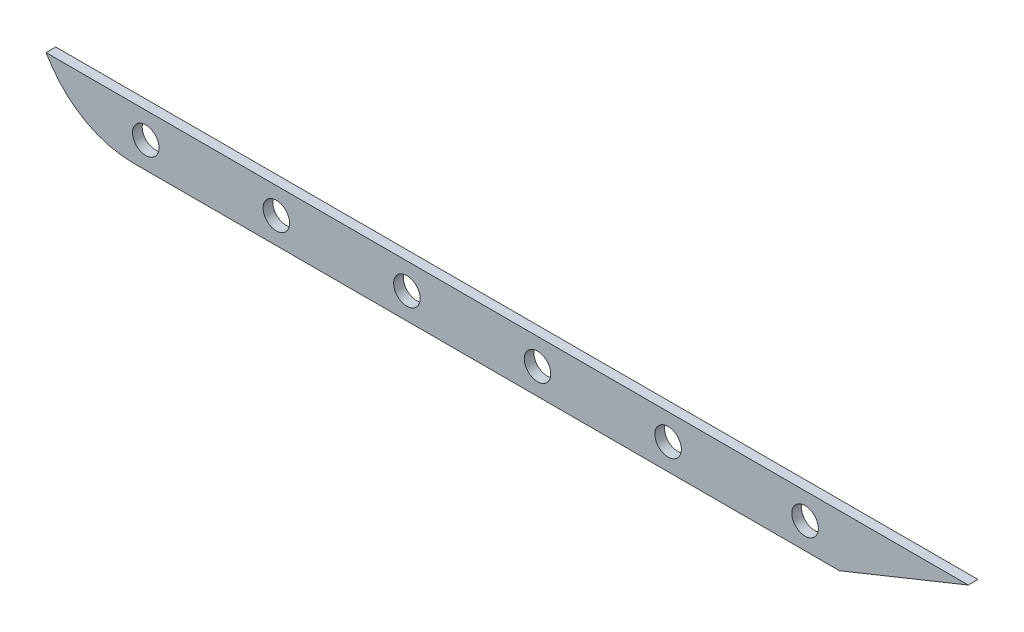
ISO-10303-21;
HEADER;
FILE_DESCRIPTION(('STEP AP214'),'2;1');
FILE_NAME('part.step','',(''),(''),'','','');
FILE_SCHEMA(('AUTOMOTIVE_DESIGN { 1 0 10303 214 1 1 1 1 }'));
ENDSEC;
DATA;
#1=APPLICATION_CONTEXT('core data for automotive mechanical design processes');
#2=APPLICATION_PROTOCOL_DEFINITION('international standard','automotive_design',2000,#1);
#3=PRODUCT_CONTEXT('',#1,'mechanical');
#4=PRODUCT('Part','Part','',(#3));
#5=PRODUCT_RELATED_PRODUCT_CATEGORY('part','',(#4));
#6=PRODUCT_DEFINITION_FORMATION('','',#4);
#7=PRODUCT_DEFINITION_CONTEXT('part definition',#1,'design');
#8=PRODUCT_DEFINITION('design','',#6,#7);
#9=PRODUCT_DEFINITION_SHAPE('','',#8);
#10=(LENGTH_UNIT() NAMED_UNIT(*) SI_UNIT(.MILLI.,.METRE.));
#11=(NAMED_UNIT(*) PLANE_ANGLE_UNIT() SI_UNIT($,.RADIAN.));
#12=(NAMED_UNIT(*) SI_UNIT($,.STERADIAN.) SOLID_ANGLE_UNIT());
#13=UNCERTAINTY_MEASURE_WITH_UNIT(LENGTH_MEASURE(1.E-05),#10,'distance_accuracy_value','');
#14=(GEOMETRIC_REPRESENTATION_CONTEXT(3) GLOBAL_UNCERTAINTY_ASSIGNED_CONTEXT((#13)) GLOBAL_UNIT_ASSIGNED_CONTEXT((#10,
#11,#12)) REPRESENTATION_CONTEXT('',''));
#15=CARTESIAN_POINT('',(0.,0.,0.));
#16=DIRECTION('',(0.,0.,1.));
#17=DIRECTION('',(1.,0.,0.));
#18=AXIS2_PLACEMENT_3D('',#15,#16,#17);
#19=CARTESIAN_POINT('',(-98.8794117647059,3.85098039215685,4.7625));
#20=DIRECTION('',(0.832050294337844,0.554700196225229,0.));
#21=DIRECTION('',(-0.554700196225229,0.832050294337844,0.));
#22=AXIS2_PLACEMENT_3D('',#19,#20,#21);
#23=PLANE('',#22);
#24=DIRECTION('',(0.554700196225229,-0.832050294337844,0.));
#25=VECTOR('',#24,1.);
#26=CARTESIAN_POINT('',(-98.8794117647059,3.85098039215685,0.));
#27=LINE('',#26,#25);
#28=CARTESIAN_POINT('',(-48.8794117647059,-71.1490196078431,0.));
#29=VERTEX_POINT('',#28);
#30=CARTESIAN_POINT('',(-46.1290054854985,-75.2746290266542,0.));
#31=VERTEX_POINT('',#30);
#32=EDGE_CURVE('E186',#29,#31,#27,.T.);
#33=ORIENTED_EDGE('',*,*,#32,.T.);
#34=DIRECTION('',(0.,0.,-1.));
#35=VECTOR('',#34,1.);
#36=CARTESIAN_POINT('',(-46.1290054854985,-75.2746290266542,4.7625));
#37=LINE('',#36,#35);
#38=CARTESIAN_POINT('',(-46.1290054854985,-75.2746290266542,4.7625));
#39=VERTEX_POINT('',#38);
#40=EDGE_CURVE('E58',#31,#39,#37,.F.);
#41=ORIENTED_EDGE('',*,*,#40,.T.);
#42=DIRECTION('',(0.554700196225229,-0.832050294337844,0.));
#43=VECTOR('',#42,1.);
#44=CARTESIAN_POINT('',(-98.8794117647059,3.85098039215685,4.7625));
#45=LINE('',#44,#43);
#46=CARTESIAN_POINT('',(-48.8794117647059,-71.1490196078431,4.7625));
#47=VERTEX_POINT('',#46);
#48=EDGE_CURVE('E108',#47,#39,#45,.T.);
#49=ORIENTED_EDGE('',*,*,#48,.F.);
#50=DIRECTION('',(0.,0.,1.));
#51=VECTOR('',#50,1.);
#52=CARTESIAN_POINT('',(-48.8794117647059,-71.1490196078431,-0.00100000000000013));
#53=LINE('',#52,#51);
#54=EDGE_CURVE('E123',#29,#47,#53,.T.);
#55=ORIENTED_EDGE('',*,*,#54,.F.);
#56=EDGE_LOOP('',(#33,#41,#49,#55));
#57=FACE_BOUND('',#56,.T.);
#58=ADVANCED_FACE('F49',(#57),#23,.F.);
#59=CARTESIAN_POINT('',(-31.8794117647059,-96.6490196078432,4.7625));
#60=DIRECTION('',(0.,1.,0.));
#61=DIRECTION('',(-1.,0.,0.));
#62=AXIS2_PLACEMENT_3D('',#59,#60,#61);
#63=PLANE('',#62);
#64=DIRECTION('',(1.,0.,0.));
#65=VECTOR('',#64,1.);
#66=CARTESIAN_POINT('',(-31.8794117647059,-96.6490196078432,0.));
#67=LINE('',#66,#65);
#68=CARTESIAN_POINT('',(-6.19059135728204,-96.6490196078432,0.));
#69=VERTEX_POINT('',#68);
#70=CARTESIAN_POINT('',(340.005873473177,-96.6490196078432,0.));
#71=VERTEX_POINT('',#70);
#72=EDGE_CURVE('E140',#69,#71,#67,.T.);
#73=ORIENTED_EDGE('',*,*,#72,.T.);
#74=DIRECTION('',(0.,0.,1.));
#75=VECTOR('',#74,1.);
#76=CARTESIAN_POINT('',(340.005873473177,-96.6490196078432,-5.2375));
#77=LINE('',#76,#75);
#78=CARTESIAN_POINT('',(340.005873473177,-96.6490196078432,4.7625));
#79=VERTEX_POINT('',#78);
#80=EDGE_CURVE('E119',#71,#79,#77,.T.);
#81=ORIENTED_EDGE('',*,*,#80,.T.);
#82=DIRECTION('',(1.,0.,0.));
#83=VECTOR('',#82,1.);
#84=CARTESIAN_POINT('',(-31.8794117647059,-96.6490196078432,4.7625));
#85=LINE('',#84,#83);
#86=CARTESIAN_POINT('',(-6.19059135728204,-96.6490196078432,4.7625));
#87=VERTEX_POINT('',#86);
#88=EDGE_CURVE('E117',#87,#79,#85,.T.);
#89=ORIENTED_EDGE('',*,*,#88,.F.);
#90=DIRECTION('',(0.,0.,-1.));
#91=VECTOR('',#90,1.);
#92=CARTESIAN_POINT('',(-6.19059135728204,-96.6490196078432,4.7625));
#93=LINE('',#92,#91);
#94=EDGE_CURVE('E107',#87,#69,#93,.T.);
#95=ORIENTED_EDGE('',*,*,#94,.T.);
#96=EDGE_LOOP('',(#73,#81,#89,#95));
#97=FACE_BOUND('',#96,.T.);
#98=ADVANCED_FACE('F201',(#97),#63,.F.);
#99=CARTESIAN_POINT('',(0.,0.,4.7625));
#100=DIRECTION('',(0.,0.,1.));
#101=DIRECTION('',(1.,0.,0.));
#102=AXIS2_PLACEMENT_3D('',#99,#100,#101);
#103=PLANE('',#102);
#104=DIRECTION('',(-0.92718385456679,-0.374606593415906,0.));
#105=VECTOR('',#104,1.);
#106=CARTESIAN_POINT('',(403.120588235294,-71.1490196078431,4.7625));
#107=LINE('',#106,#105);
#108=CARTESIAN_POINT('',(403.120588235294,-71.1490196078431,4.7625));
#109=VERTEX_POINT('',#108);
#110=EDGE_CURVE('E99',#109,#79,#107,.T.);
#111=ORIENTED_EDGE('',*,*,#110,.F.);
#112=DIRECTION('',(1.,0.,0.));
#113=VECTOR('',#112,1.);
#114=CARTESIAN_POINT('',(-48.8794117647059,-71.1490196078431,4.7625));
#115=LINE('',#114,#113);
#116=EDGE_CURVE('E115',#47,#109,#115,.T.);
#117=ORIENTED_EDGE('',*,*,#116,.F.);
#118=ORIENTED_EDGE('',*,*,#48,.T.);
#119=CARTESIAN_POINT('',(-6.19059135728204,-48.6490196078432,4.7625));
#120=DIRECTION('',(0.,0.,1.));
#121=DIRECTION('',(1.,0.,0.));
#122=AXIS2_PLACEMENT_3D('',#119,#120,#121);
#123=CIRCLE('',#122,48.);
#124=EDGE_CURVE('E11',#39,#87,#123,.T.);
#125=ORIENTED_EDGE('',*,*,#124,.T.);
#126=ORIENTED_EDGE('',*,*,#88,.T.);
#127=EDGE_LOOP('',(#111,#117,#118,#125,#126));
#128=FACE_BOUND('',#127,.T.);
#129=CARTESIAN_POINT('',(0.,-83.8990196078432,4.7625));
#130=DIRECTION('',(0.,0.,1.));
#131=DIRECTION('',(1.,0.,0.));
#132=AXIS2_PLACEMENT_3D('',#129,#130,#131);
#133=CIRCLE('',#132,6.50000000000001);
#134=CARTESIAN_POINT('',(-6.5,-83.8990196078432,4.7625));
#135=VERTEX_POINT('',#134);
#136=EDGE_CURVE('E136',#135,#135,#133,.T.);
#137=ORIENTED_EDGE('',*,*,#136,.F.);
#138=EDGE_LOOP('',(#137));
#139=FACE_BOUND('',#138,.T.);
#140=CARTESIAN_POINT('',(64.,-83.8990196078433,4.7625));
#141=DIRECTION('',(0.,0.,1.));
#142=DIRECTION('',(1.,0.,0.));
#143=AXIS2_PLACEMENT_3D('',#140,#141,#142);
#144=CIRCLE('',#143,6.5);
#145=CARTESIAN_POINT('',(57.5,-83.8990196078433,4.7625));
#146=VERTEX_POINT('',#145);
#147=EDGE_CURVE('E149',#146,#146,#144,.T.);
#148=ORIENTED_EDGE('',*,*,#147,.F.);
#149=EDGE_LOOP('',(#148));
#150=FACE_BOUND('',#149,.T.);
#151=CARTESIAN_POINT('',(128.,-83.8990196078432,4.7625));
#152=DIRECTION('',(0.,0.,1.));
#153=DIRECTION('',(1.,0.,0.));
#154=AXIS2_PLACEMENT_3D('',#151,#152,#153);
#155=CIRCLE('',#154,6.50000000000002);
#156=CARTESIAN_POINT('',(121.5,-83.8990196078432,4.7625));
#157=VERTEX_POINT('',#156);
#158=EDGE_CURVE('E157',#157,#157,#155,.T.);
#159=ORIENTED_EDGE('',*,*,#158,.F.);
#160=EDGE_LOOP('',(#159));
#161=FACE_BOUND('',#160,.T.);
#162=CARTESIAN_POINT('',(192.,-83.8990196078432,4.7625));
#163=DIRECTION('',(0.,0.,1.));
#164=DIRECTION('',(1.,0.,0.));
#165=AXIS2_PLACEMENT_3D('',#162,#163,#164);
#166=CIRCLE('',#165,6.50000000000002);
#167=CARTESIAN_POINT('',(185.5,-83.8990196078432,4.7625));
#168=VERTEX_POINT('',#167);
#169=EDGE_CURVE('E165',#168,#168,#166,.T.);
#170=ORIENTED_EDGE('',*,*,#169,.F.);
#171=EDGE_LOOP('',(#170));
#172=FACE_BOUND('',#171,.T.);
#173=CARTESIAN_POINT('',(256.,-83.8990196078432,4.7625));
#174=DIRECTION('',(0.,0.,1.));
#175=DIRECTION('',(1.,0.,0.));
#176=AXIS2_PLACEMENT_3D('',#173,#174,#175);
#177=CIRCLE('',#176,6.50000000000002);
#178=CARTESIAN_POINT('',(249.5,-83.8990196078432,4.7625));
#179=VERTEX_POINT('',#178);
#180=EDGE_CURVE('E173',#179,#179,#177,.T.);
#181=ORIENTED_EDGE('',*,*,#180,.F.);
#182=EDGE_LOOP('',(#181));
#183=FACE_BOUND('',#182,.T.);
#184=CARTESIAN_POINT('',(323.120588235294,-83.8990196078432,4.7625));
#185=DIRECTION('',(0.,0.,1.));
#186=DIRECTION('',(1.,0.,0.));
#187=AXIS2_PLACEMENT_3D('',#184,#185,#186);
#188=CIRCLE('',#187,6.50000000000002);
#189=CARTESIAN_POINT('',(316.620588235294,-83.8990196078432,4.7625));
#190=VERTEX_POINT('',#189);
#191=EDGE_CURVE('E135',#190,#190,#188,.T.);
#192=ORIENTED_EDGE('',*,*,#191,.F.);
#193=EDGE_LOOP('',(#192));
#194=FACE_BOUND('',#193,.T.);
#195=ADVANCED_FACE('F113',(#128,#139,#150,#161,#172,#183,#194),#103,.T.);
#196=CARTESIAN_POINT('',(0.,0.,0.));
#197=DIRECTION('',(0.,0.,1.));
#198=DIRECTION('',(1.,0.,0.));
#199=AXIS2_PLACEMENT_3D('',#196,#197,#198);
#200=PLANE('',#199);
#201=CARTESIAN_POINT('',(0.,-83.8990196078432,0.));
#202=DIRECTION('',(0.,0.,1.));
#203=DIRECTION('',(1.,0.,0.));
#204=AXIS2_PLACEMENT_3D('',#201,#202,#203);
#205=CIRCLE('',#204,6.50000000000001);
#206=CARTESIAN_POINT('',(-6.5,-83.8990196078432,0.));
#207=VERTEX_POINT('',#206);
#208=EDGE_CURVE('E141',#207,#207,#205,.T.);
#209=ORIENTED_EDGE('',*,*,#208,.T.);
#210=EDGE_LOOP('',(#209));
#211=FACE_BOUND('',#210,.T.);
#212=CARTESIAN_POINT('',(64.,-83.8990196078433,0.));
#213=DIRECTION('',(0.,0.,1.));
#214=DIRECTION('',(1.,0.,0.));
#215=AXIS2_PLACEMENT_3D('',#212,#213,#214);
#216=CIRCLE('',#215,6.5);
#217=CARTESIAN_POINT('',(57.5,-83.8990196078433,0.));
#218=VERTEX_POINT('',#217);
#219=EDGE_CURVE('E145',#218,#218,#216,.T.);
#220=ORIENTED_EDGE('',*,*,#219,.T.);
#221=EDGE_LOOP('',(#220));
#222=FACE_BOUND('',#221,.T.);
#223=CARTESIAN_POINT('',(128.,-83.8990196078432,0.));
#224=DIRECTION('',(0.,0.,1.));
#225=DIRECTION('',(1.,0.,0.));
#226=AXIS2_PLACEMENT_3D('',#223,#224,#225);
#227=CIRCLE('',#226,6.50000000000002);
#228=CARTESIAN_POINT('',(121.5,-83.8990196078432,0.));
#229=VERTEX_POINT('',#228);
#230=EDGE_CURVE('E153',#229,#229,#227,.T.);
#231=ORIENTED_EDGE('',*,*,#230,.T.);
#232=EDGE_LOOP('',(#231));
#233=FACE_BOUND('',#232,.T.);
#234=CARTESIAN_POINT('',(192.,-83.8990196078432,0.));
#235=DIRECTION('',(0.,0.,1.));
#236=DIRECTION('',(1.,0.,0.));
#237=AXIS2_PLACEMENT_3D('',#234,#235,#236);
#238=CIRCLE('',#237,6.50000000000002);
#239=CARTESIAN_POINT('',(185.5,-83.8990196078432,0.));
#240=VERTEX_POINT('',#239);
#241=EDGE_CURVE('E161',#240,#240,#238,.T.);
#242=ORIENTED_EDGE('',*,*,#241,.T.);
#243=EDGE_LOOP('',(#242));
#244=FACE_BOUND('',#243,.T.);
#245=CARTESIAN_POINT('',(256.,-83.8990196078432,0.));
#246=DIRECTION('',(0.,0.,1.));
#247=DIRECTION('',(1.,0.,0.));
#248=AXIS2_PLACEMENT_3D('',#245,#246,#247);
#249=CIRCLE('',#248,6.50000000000002);
#250=CARTESIAN_POINT('',(249.5,-83.8990196078432,0.));
#251=VERTEX_POINT('',#250);
#252=EDGE_CURVE('E169',#251,#251,#249,.T.);
#253=ORIENTED_EDGE('',*,*,#252,.T.);
#254=EDGE_LOOP('',(#253));
#255=FACE_BOUND('',#254,.T.);
#256=CARTESIAN_POINT('',(323.120588235294,-83.8990196078432,0.));
#257=DIRECTION('',(0.,0.,1.));
#258=DIRECTION('',(1.,0.,0.));
#259=AXIS2_PLACEMENT_3D('',#256,#257,#258);
#260=CIRCLE('',#259,6.50000000000002);
#261=CARTESIAN_POINT('',(316.620588235294,-83.8990196078432,0.));
#262=VERTEX_POINT('',#261);
#263=EDGE_CURVE('E177',#262,#262,#260,.T.);
#264=ORIENTED_EDGE('',*,*,#263,.T.);
#265=EDGE_LOOP('',(#264));
#266=FACE_BOUND('',#265,.T.);
#267=DIRECTION('',(-1.,0.,0.));
#268=VECTOR('',#267,1.);
#269=CARTESIAN_POINT('',(-48.8794117647059,-71.1490196078431,0.));
#270=LINE('',#269,#268);
#271=CARTESIAN_POINT('',(403.120588235294,-71.1490196078431,0.));
#272=VERTEX_POINT('',#271);
#273=EDGE_CURVE('E128',#272,#29,#270,.T.);
#274=ORIENTED_EDGE('',*,*,#273,.F.);
#275=DIRECTION('',(-0.92718385456679,-0.374606593415906,0.));
#276=VECTOR('',#275,1.);
#277=CARTESIAN_POINT('',(81.2820834011268,-201.180216044419,0.));
#278=LINE('',#277,#276);
#279=EDGE_CURVE('E102',#272,#71,#278,.T.);
#280=ORIENTED_EDGE('',*,*,#279,.T.);
#281=ORIENTED_EDGE('',*,*,#72,.F.);
#282=CARTESIAN_POINT('',(-6.19059135728204,-48.6490196078432,0.));
#283=DIRECTION('',(0.,0.,1.));
#284=DIRECTION('',(1.,0.,0.));
#285=AXIS2_PLACEMENT_3D('',#282,#283,#284);
#286=CIRCLE('',#285,48.);
#287=EDGE_CURVE('E72',#69,#31,#286,.F.);
#288=ORIENTED_EDGE('',*,*,#287,.T.);
#289=ORIENTED_EDGE('',*,*,#32,.F.);
#290=EDGE_LOOP('',(#274,#280,#281,#288,#289));
#291=FACE_BOUND('',#290,.T.);
#292=ADVANCED_FACE('F204',(#211,#222,#233,#244,#255,#266,#291),#200,.F.);
#293=CARTESIAN_POINT('',(323.120588235294,-83.8990196078432,4.7625));
#294=DIRECTION('',(0.,0.,-1.));
#295=DIRECTION('',(-1.,0.,0.));
#296=AXIS2_PLACEMENT_3D('',#293,#294,#295);
#297=CYLINDRICAL_SURFACE('',#296,6.50000000000002);
#298=CARTESIAN_POINT('',(316.620588235294,-83.8990196078432,4.7625));
#299=CARTESIAN_POINT('',(316.620588235294,-83.8990196078432,4.712890625));
#300=CARTESIAN_POINT('',(316.620588235294,-83.8990196078432,4.66328125));
#301=CARTESIAN_POINT('',(316.620588235294,-83.8990196078432,4.5640625));
#302=CARTESIAN_POINT('',(316.620588235294,-83.8990196078432,4.514453125));
#303=CARTESIAN_POINT('',(316.620588235294,-83.8990196078432,4.415234375));
#304=CARTESIAN_POINT('',(316.620588235294,-83.8990196078432,4.365625));
#305=CARTESIAN_POINT('',(316.620588235294,-83.8990196078432,4.26640625));
#306=CARTESIAN_POINT('',(316.620588235294,-83.8990196078432,4.216796875));
#307=CARTESIAN_POINT('',(316.620588235294,-83.8990196078432,4.117578125));
#308=CARTESIAN_POINT('',(316.620588235294,-83.8990196078432,4.06796875));
#309=CARTESIAN_POINT('',(316.620588235294,-83.8990196078432,3.96875));
#310=CARTESIAN_POINT('',(316.620588235294,-83.8990196078432,3.919140625));
#311=CARTESIAN_POINT('',(316.620588235294,-83.8990196078432,3.819921875));
#312=CARTESIAN_POINT('',(316.620588235294,-83.8990196078432,3.7703125));
#313=CARTESIAN_POINT('',(316.620588235294,-83.8990196078432,3.67109375));
#314=CARTESIAN_POINT('',(316.620588235294,-83.8990196078432,3.621484375));
#315=CARTESIAN_POINT('',(316.620588235294,-83.8990196078432,3.522265625));
#316=CARTESIAN_POINT('',(316.620588235294,-83.8990196078432,3.47265625));
#317=CARTESIAN_POINT('',(316.620588235294,-83.8990196078432,3.3734375));
#318=CARTESIAN_POINT('',(316.620588235294,-83.8990196078432,3.323828125));
#319=CARTESIAN_POINT('',(316.620588235294,-83.8990196078432,3.224609375));
#320=CARTESIAN_POINT('',(316.620588235294,-83.8990196078432,3.175));
#321=CARTESIAN_POINT('',(316.620588235294,-83.8990196078432,3.07578125));
#322=CARTESIAN_POINT('',(316.620588235294,-83.8990196078432,3.026171875));
#323=CARTESIAN_POINT('',(316.620588235294,-83.8990196078432,2.926953125));
#324=CARTESIAN_POINT('',(316.620588235294,-83.8990196078432,2.87734375));
#325=CARTESIAN_POINT('',(316.620588235294,-83.8990196078432,2.778125));
#326=CARTESIAN_POINT('',(316.620588235294,-83.8990196078432,2.728515625));
#327=CARTESIAN_POINT('',(316.620588235294,-83.8990196078432,2.629296875));
#328=CARTESIAN_POINT('',(316.620588235294,-83.8990196078432,2.5796875));
#329=CARTESIAN_POINT('',(316.620588235294,-83.8990196078432,2.48046875));
#330=CARTESIAN_POINT('',(316.620588235294,-83.8990196078432,2.430859375));
#331=CARTESIAN_POINT('',(316.620588235294,-83.8990196078432,2.331640625));
#332=CARTESIAN_POINT('',(316.620588235294,-83.8990196078432,2.28203125));
#333=CARTESIAN_POINT('',(316.620588235294,-83.8990196078432,2.1828125));
#334=CARTESIAN_POINT('',(316.620588235294,-83.8990196078432,2.133203125));
#335=CARTESIAN_POINT('',(316.620588235294,-83.8990196078432,2.033984375));
#336=CARTESIAN_POINT('',(316.620588235294,-83.8990196078432,1.984375));
#337=CARTESIAN_POINT('',(316.620588235294,-83.8990196078432,1.88515625));
#338=CARTESIAN_POINT('',(316.620588235294,-83.8990196078432,1.835546875));
#339=CARTESIAN_POINT('',(316.620588235294,-83.8990196078432,1.736328125));
#340=CARTESIAN_POINT('',(316.620588235294,-83.8990196078432,1.68671875));
#341=CARTESIAN_POINT('',(316.620588235294,-83.8990196078432,1.5875));
#342=CARTESIAN_POINT('',(316.620588235294,-83.8990196078432,1.537890625));
#343=CARTESIAN_POINT('',(316.620588235294,-83.8990196078432,1.438671875));
#344=CARTESIAN_POINT('',(316.620588235294,-83.8990196078432,1.3890625));
#345=CARTESIAN_POINT('',(316.620588235294,-83.8990196078432,1.28984375));
#346=CARTESIAN_POINT('',(316.620588235294,-83.8990196078432,1.240234375));
#347=CARTESIAN_POINT('',(316.620588235294,-83.8990196078432,1.141015625));
#348=CARTESIAN_POINT('',(316.620588235294,-83.8990196078432,1.09140625));
#349=CARTESIAN_POINT('',(316.620588235294,-83.8990196078432,0.992187499999999));
#350=CARTESIAN_POINT('',(316.620588235294,-83.8990196078432,0.942578124999999));
#351=CARTESIAN_POINT('',(316.620588235294,-83.8990196078432,0.843359375));
#352=CARTESIAN_POINT('',(316.620588235294,-83.8990196078432,0.79375));
#353=CARTESIAN_POINT('',(316.620588235294,-83.8990196078432,0.69453125));
#354=CARTESIAN_POINT('',(316.620588235294,-83.8990196078432,0.644921875));
#355=CARTESIAN_POINT('',(316.620588235294,-83.8990196078432,0.545703125));
#356=CARTESIAN_POINT('',(316.620588235294,-83.8990196078432,0.49609375));
#357=CARTESIAN_POINT('',(316.620588235294,-83.8990196078432,0.396875));
#358=CARTESIAN_POINT('',(316.620588235294,-83.8990196078432,0.347265625));
#359=CARTESIAN_POINT('',(316.620588235294,-83.8990196078432,0.248046875));
#360=CARTESIAN_POINT('',(316.620588235294,-83.8990196078432,0.1984375));
#361=CARTESIAN_POINT('',(316.620588235294,-83.8990196078432,0.09921875));
#362=CARTESIAN_POINT('',(316.620588235294,-83.8990196078432,0.049609375));
#363=CARTESIAN_POINT('',(316.620588235294,-83.8990196078432,0.));
#364=B_SPLINE_CURVE_WITH_KNOTS('',3,(#298,#299,#300,#301,#302,#303,#304,#305,#306,#307,#308,
#309,#310,#311,#312,#313,#314,#315,#316,#317,#318,#319,#320,#321,#322,#323,#324,#325,#326,#327,
#328,#329,#330,#331,#332,#333,#334,#335,#336,#337,#338,#339,#340,#341,#342,#343,#344,#345,#346,
#347,#348,#349,#350,#351,#352,#353,#354,#355,#356,#357,#358,#359,#360,#361,#362,#363),
.UNSPECIFIED.,.F.,.F.,(4,2,2,2,2,2,2,2,2,2,2,2,2,2,2,2,2,2,2,2,2,2,2,2,2,2,2,2,2,2,2,2,4),(0.,
0.148828125,0.29765625,0.446484375,0.5953125,0.744140625,0.892968750000001,1.041796875,1.190625,
1.339453125,1.48828125,1.637109375,1.7859375,1.934765625,2.08359375,2.232421875,2.38125,
2.530078125,2.67890625,2.827734375,2.9765625,3.125390625,3.27421875,3.423046875,3.571875,
3.720703125,3.86953125,4.018359375,4.1671875,4.316015625,4.46484375,4.613671875,4.7625),.UNSPECIFIED.);
#365=EDGE_CURVE('BSEAM222',#190,#262,#364,.T.);
#366=ORIENTED_EDGE('',*,*,#191,.T.);
#367=ORIENTED_EDGE('',*,*,#263,.F.);
#368=ORIENTED_EDGE('',*,*,#365,.T.);
#369=ORIENTED_EDGE('',*,*,#365,.F.);
#370=EDGE_LOOP('',(#366,#368,#367,#369));
#371=FACE_BOUND('',#370,.T.);
#372=ADVANCED_FACE('F222',(#371),#297,.F.);
#373=CARTESIAN_POINT('',(256.,-83.8990196078432,4.7625));
#374=DIRECTION('',(0.,0.,-1.));
#375=DIRECTION('',(-1.,0.,0.));
#376=AXIS2_PLACEMENT_3D('',#373,#374,#375);
#377=CYLINDRICAL_SURFACE('',#376,6.50000000000002);
#378=CARTESIAN_POINT('',(249.5,-83.8990196078432,4.7625));
#379=CARTESIAN_POINT('',(249.5,-83.8990196078432,4.712890625));
#380=CARTESIAN_POINT('',(249.5,-83.8990196078432,4.66328125));
#381=CARTESIAN_POINT('',(249.5,-83.8990196078432,4.5640625));
#382=CARTESIAN_POINT('',(249.5,-83.8990196078432,4.514453125));
#383=CARTESIAN_POINT('',(249.5,-83.8990196078432,4.415234375));
#384=CARTESIAN_POINT('',(249.5,-83.8990196078432,4.365625));
#385=CARTESIAN_POINT('',(249.5,-83.8990196078432,4.26640625));
#386=CARTESIAN_POINT('',(249.5,-83.8990196078432,4.216796875));
#387=CARTESIAN_POINT('',(249.5,-83.8990196078432,4.117578125));
#388=CARTESIAN_POINT('',(249.5,-83.8990196078432,4.06796875));
#389=CARTESIAN_POINT('',(249.5,-83.8990196078432,3.96875));
#390=CARTESIAN_POINT('',(249.5,-83.8990196078432,3.919140625));
#391=CARTESIAN_POINT('',(249.5,-83.8990196078432,3.819921875));
#392=CARTESIAN_POINT('',(249.5,-83.8990196078432,3.7703125));
#393=CARTESIAN_POINT('',(249.5,-83.8990196078432,3.67109375));
#394=CARTESIAN_POINT('',(249.5,-83.8990196078432,3.621484375));
#395=CARTESIAN_POINT('',(249.5,-83.8990196078432,3.522265625));
#396=CARTESIAN_POINT('',(249.5,-83.8990196078432,3.47265625));
#397=CARTESIAN_POINT('',(249.5,-83.8990196078432,3.3734375));
#398=CARTESIAN_POINT('',(249.5,-83.8990196078432,3.323828125));
#399=CARTESIAN_POINT('',(249.5,-83.8990196078432,3.224609375));
#400=CARTESIAN_POINT('',(249.5,-83.8990196078432,3.175));
#401=CARTESIAN_POINT('',(249.5,-83.8990196078432,3.07578125));
#402=CARTESIAN_POINT('',(249.5,-83.8990196078432,3.026171875));
#403=CARTESIAN_POINT('',(249.5,-83.8990196078432,2.926953125));
#404=CARTESIAN_POINT('',(249.5,-83.8990196078432,2.87734375));
#405=CARTESIAN_POINT('',(249.5,-83.8990196078432,2.778125));
#406=CARTESIAN_POINT('',(249.5,-83.8990196078432,2.728515625));
#407=CARTESIAN_POINT('',(249.5,-83.8990196078432,2.629296875));
#408=CARTESIAN_POINT('',(249.5,-83.8990196078432,2.5796875));
#409=CARTESIAN_POINT('',(249.5,-83.8990196078432,2.48046875));
#410=CARTESIAN_POINT('',(249.5,-83.8990196078432,2.430859375));
#411=CARTESIAN_POINT('',(249.5,-83.8990196078432,2.331640625));
#412=CARTESIAN_POINT('',(249.5,-83.8990196078432,2.28203125));
#413=CARTESIAN_POINT('',(249.5,-83.8990196078432,2.1828125));
#414=CARTESIAN_POINT('',(249.5,-83.8990196078432,2.133203125));
#415=CARTESIAN_POINT('',(249.5,-83.8990196078432,2.033984375));
#416=CARTESIAN_POINT('',(249.5,-83.8990196078432,1.984375));
#417=CARTESIAN_POINT('',(249.5,-83.8990196078432,1.88515625));
#418=CARTESIAN_POINT('',(249.5,-83.8990196078432,1.835546875));
#419=CARTESIAN_POINT('',(249.5,-83.8990196078432,1.736328125));
#420=CARTESIAN_POINT('',(249.5,-83.8990196078432,1.68671875));
#421=CARTESIAN_POINT('',(249.5,-83.8990196078432,1.5875));
#422=CARTESIAN_POINT('',(249.5,-83.8990196078432,1.537890625));
#423=CARTESIAN_POINT('',(249.5,-83.8990196078432,1.438671875));
#424=CARTESIAN_POINT('',(249.5,-83.8990196078432,1.3890625));
#425=CARTESIAN_POINT('',(249.5,-83.8990196078432,1.28984375));
#426=CARTESIAN_POINT('',(249.5,-83.8990196078432,1.240234375));
#427=CARTESIAN_POINT('',(249.5,-83.8990196078432,1.141015625));
#428=CARTESIAN_POINT('',(249.5,-83.8990196078432,1.09140625));
#429=CARTESIAN_POINT('',(249.5,-83.8990196078432,0.992187499999999));
#430=CARTESIAN_POINT('',(249.5,-83.8990196078432,0.942578124999999));
#431=CARTESIAN_POINT('',(249.5,-83.8990196078432,0.843359375));
#432=CARTESIAN_POINT('',(249.5,-83.8990196078432,0.79375));
#433=CARTESIAN_POINT('',(249.5,-83.8990196078432,0.69453125));
#434=CARTESIAN_POINT('',(249.5,-83.8990196078432,0.644921875));
#435=CARTESIAN_POINT('',(249.5,-83.8990196078432,0.545703125));
#436=CARTESIAN_POINT('',(249.5,-83.8990196078432,0.49609375));
#437=CARTESIAN_POINT('',(249.5,-83.8990196078432,0.396875));
#438=CARTESIAN_POINT('',(249.5,-83.8990196078432,0.347265625));
#439=CARTESIAN_POINT('',(249.5,-83.8990196078432,0.248046875));
#440=CARTESIAN_POINT('',(249.5,-83.8990196078432,0.1984375));
#441=CARTESIAN_POINT('',(249.5,-83.8990196078432,0.09921875));
#442=CARTESIAN_POINT('',(249.5,-83.8990196078432,0.049609375));
#443=CARTESIAN_POINT('',(249.5,-83.8990196078432,0.));
#444=B_SPLINE_CURVE_WITH_KNOTS('',3,(#378,#379,#380,#381,#382,#383,#384,#385,#386,#387,#388,
#389,#390,#391,#392,#393,#394,#395,#396,#397,#398,#399,#400,#401,#402,#403,#404,#405,#406,#407,
#408,#409,#410,#411,#412,#413,#414,#415,#416,#417,#418,#419,#420,#421,#422,#423,#424,#425,#426,
#427,#428,#429,#430,#431,#432,#433,#434,#435,#436,#437,#438,#439,#440,#441,#442,#443),
.UNSPECIFIED.,.F.,.F.,(4,2,2,2,2,2,2,2,2,2,2,2,2,2,2,2,2,2,2,2,2,2,2,2,2,2,2,2,2,2,2,2,4),(0.,
0.148828125,0.29765625,0.446484375,0.5953125,0.744140625,0.892968750000001,1.041796875,1.190625,
1.339453125,1.48828125,1.637109375,1.7859375,1.934765625,2.08359375,2.232421875,2.38125,
2.530078125,2.67890625,2.827734375,2.9765625,3.125390625,3.27421875,3.423046875,3.571875,
3.720703125,3.86953125,4.018359375,4.1671875,4.316015625,4.46484375,4.613671875,4.7625),.UNSPECIFIED.);
#445=EDGE_CURVE('BSEAM228',#179,#251,#444,.T.);
#446=ORIENTED_EDGE('',*,*,#180,.T.);
#447=ORIENTED_EDGE('',*,*,#252,.F.);
#448=ORIENTED_EDGE('',*,*,#445,.T.);
#449=ORIENTED_EDGE('',*,*,#445,.F.);
#450=EDGE_LOOP('',(#446,#448,#447,#449));
#451=FACE_BOUND('',#450,.T.);
#452=ADVANCED_FACE('F228',(#451),#377,.F.);
#453=CARTESIAN_POINT('',(192.,-83.8990196078432,4.7625));
#454=DIRECTION('',(0.,0.,-1.));
#455=DIRECTION('',(-1.,0.,0.));
#456=AXIS2_PLACEMENT_3D('',#453,#454,#455);
#457=CYLINDRICAL_SURFACE('',#456,6.50000000000002);
#458=CARTESIAN_POINT('',(185.5,-83.8990196078432,4.7625));
#459=CARTESIAN_POINT('',(185.5,-83.8990196078432,4.712890625));
#460=CARTESIAN_POINT('',(185.5,-83.8990196078432,4.66328125));
#461=CARTESIAN_POINT('',(185.5,-83.8990196078432,4.5640625));
#462=CARTESIAN_POINT('',(185.5,-83.8990196078432,4.514453125));
#463=CARTESIAN_POINT('',(185.5,-83.8990196078432,4.415234375));
#464=CARTESIAN_POINT('',(185.5,-83.8990196078432,4.365625));
#465=CARTESIAN_POINT('',(185.5,-83.8990196078432,4.26640625));
#466=CARTESIAN_POINT('',(185.5,-83.8990196078432,4.216796875));
#467=CARTESIAN_POINT('',(185.5,-83.8990196078432,4.117578125));
#468=CARTESIAN_POINT('',(185.5,-83.8990196078432,4.06796875));
#469=CARTESIAN_POINT('',(185.5,-83.8990196078432,3.96875));
#470=CARTESIAN_POINT('',(185.5,-83.8990196078432,3.919140625));
#471=CARTESIAN_POINT('',(185.5,-83.8990196078432,3.819921875));
#472=CARTESIAN_POINT('',(185.5,-83.8990196078432,3.7703125));
#473=CARTESIAN_POINT('',(185.5,-83.8990196078432,3.67109375));
#474=CARTESIAN_POINT('',(185.5,-83.8990196078432,3.621484375));
#475=CARTESIAN_POINT('',(185.5,-83.8990196078432,3.522265625));
#476=CARTESIAN_POINT('',(185.5,-83.8990196078432,3.47265625));
#477=CARTESIAN_POINT('',(185.5,-83.8990196078432,3.3734375));
#478=CARTESIAN_POINT('',(185.5,-83.8990196078432,3.323828125));
#479=CARTESIAN_POINT('',(185.5,-83.8990196078432,3.224609375));
#480=CARTESIAN_POINT('',(185.5,-83.8990196078432,3.175));
#481=CARTESIAN_POINT('',(185.5,-83.8990196078432,3.07578125));
#482=CARTESIAN_POINT('',(185.5,-83.8990196078432,3.026171875));
#483=CARTESIAN_POINT('',(185.5,-83.8990196078432,2.926953125));
#484=CARTESIAN_POINT('',(185.5,-83.8990196078432,2.87734375));
#485=CARTESIAN_POINT('',(185.5,-83.8990196078432,2.778125));
#486=CARTESIAN_POINT('',(185.5,-83.8990196078432,2.728515625));
#487=CARTESIAN_POINT('',(185.5,-83.8990196078432,2.629296875));
#488=CARTESIAN_POINT('',(185.5,-83.8990196078432,2.5796875));
#489=CARTESIAN_POINT('',(185.5,-83.8990196078432,2.48046875));
#490=CARTESIAN_POINT('',(185.5,-83.8990196078432,2.430859375));
#491=CARTESIAN_POINT('',(185.5,-83.8990196078432,2.331640625));
#492=CARTESIAN_POINT('',(185.5,-83.8990196078432,2.28203125));
#493=CARTESIAN_POINT('',(185.5,-83.8990196078432,2.1828125));
#494=CARTESIAN_POINT('',(185.5,-83.8990196078432,2.133203125));
#495=CARTESIAN_POINT('',(185.5,-83.8990196078432,2.033984375));
#496=CARTESIAN_POINT('',(185.5,-83.8990196078432,1.984375));
#497=CARTESIAN_POINT('',(185.5,-83.8990196078432,1.88515625));
#498=CARTESIAN_POINT('',(185.5,-83.8990196078432,1.835546875));
#499=CARTESIAN_POINT('',(185.5,-83.8990196078432,1.736328125));
#500=CARTESIAN_POINT('',(185.5,-83.8990196078432,1.68671875));
#501=CARTESIAN_POINT('',(185.5,-83.8990196078432,1.5875));
#502=CARTESIAN_POINT('',(185.5,-83.8990196078432,1.537890625));
#503=CARTESIAN_POINT('',(185.5,-83.8990196078432,1.438671875));
#504=CARTESIAN_POINT('',(185.5,-83.8990196078432,1.3890625));
#505=CARTESIAN_POINT('',(185.5,-83.8990196078432,1.28984375));
#506=CARTESIAN_POINT('',(185.5,-83.8990196078432,1.240234375));
#507=CARTESIAN_POINT('',(185.5,-83.8990196078432,1.141015625));
#508=CARTESIAN_POINT('',(185.5,-83.8990196078432,1.09140625));
#509=CARTESIAN_POINT('',(185.5,-83.8990196078432,0.992187499999999));
#510=CARTESIAN_POINT('',(185.5,-83.8990196078432,0.942578124999999));
#511=CARTESIAN_POINT('',(185.5,-83.8990196078432,0.843359375));
#512=CARTESIAN_POINT('',(185.5,-83.8990196078432,0.79375));
#513=CARTESIAN_POINT('',(185.5,-83.8990196078432,0.69453125));
#514=CARTESIAN_POINT('',(185.5,-83.8990196078432,0.644921875));
#515=CARTESIAN_POINT('',(185.5,-83.8990196078432,0.545703125));
#516=CARTESIAN_POINT('',(185.5,-83.8990196078432,0.49609375));
#517=CARTESIAN_POINT('',(185.5,-83.8990196078432,0.396875));
#518=CARTESIAN_POINT('',(185.5,-83.8990196078432,0.347265625));
#519=CARTESIAN_POINT('',(185.5,-83.8990196078432,0.248046875));
#520=CARTESIAN_POINT('',(185.5,-83.8990196078432,0.1984375));
#521=CARTESIAN_POINT('',(185.5,-83.8990196078432,0.09921875));
#522=CARTESIAN_POINT('',(185.5,-83.8990196078432,0.049609375));
#523=CARTESIAN_POINT('',(185.5,-83.8990196078432,0.));
#524=B_SPLINE_CURVE_WITH_KNOTS('',3,(#458,#459,#460,#461,#462,#463,#464,#465,#466,#467,#468,
#469,#470,#471,#472,#473,#474,#475,#476,#477,#478,#479,#480,#481,#482,#483,#484,#485,#486,#487,
#488,#489,#490,#491,#492,#493,#494,#495,#496,#497,#498,#499,#500,#501,#502,#503,#504,#505,#506,
#507,#508,#509,#510,#511,#512,#513,#514,#515,#516,#517,#518,#519,#520,#521,#522,#523),
.UNSPECIFIED.,.F.,.F.,(4,2,2,2,2,2,2,2,2,2,2,2,2,2,2,2,2,2,2,2,2,2,2,2,2,2,2,2,2,2,2,2,4),(0.,
0.148828125,0.29765625,0.446484375,0.5953125,0.744140625,0.892968750000001,1.041796875,1.190625,
1.339453125,1.48828125,1.637109375,1.7859375,1.934765625,2.08359375,2.232421875,2.38125,
2.530078125,2.67890625,2.827734375,2.9765625,3.125390625,3.27421875,3.423046875,3.571875,
3.720703125,3.86953125,4.018359375,4.1671875,4.316015625,4.46484375,4.613671875,4.7625),.UNSPECIFIED.);
#525=EDGE_CURVE('BSEAM232',#168,#240,#524,.T.);
#526=ORIENTED_EDGE('',*,*,#169,.T.);
#527=ORIENTED_EDGE('',*,*,#241,.F.);
#528=ORIENTED_EDGE('',*,*,#525,.T.);
#529=ORIENTED_EDGE('',*,*,#525,.F.);
#530=EDGE_LOOP('',(#526,#528,#527,#529));
#531=FACE_BOUND('',#530,.T.);
#532=ADVANCED_FACE('F232',(#531),#457,.F.);
#533=CARTESIAN_POINT('',(128.,-83.8990196078432,4.7625));
#534=DIRECTION('',(0.,0.,-1.));
#535=DIRECTION('',(-1.,0.,0.));
#536=AXIS2_PLACEMENT_3D('',#533,#534,#535);
#537=CYLINDRICAL_SURFACE('',#536,6.50000000000002);
#538=CARTESIAN_POINT('',(121.5,-83.8990196078432,4.7625));
#539=CARTESIAN_POINT('',(121.5,-83.8990196078432,4.712890625));
#540=CARTESIAN_POINT('',(121.5,-83.8990196078432,4.66328125));
#541=CARTESIAN_POINT('',(121.5,-83.8990196078432,4.5640625));
#542=CARTESIAN_POINT('',(121.5,-83.8990196078432,4.514453125));
#543=CARTESIAN_POINT('',(121.5,-83.8990196078432,4.415234375));
#544=CARTESIAN_POINT('',(121.5,-83.8990196078432,4.365625));
#545=CARTESIAN_POINT('',(121.5,-83.8990196078432,4.26640625));
#546=CARTESIAN_POINT('',(121.5,-83.8990196078432,4.216796875));
#547=CARTESIAN_POINT('',(121.5,-83.8990196078432,4.117578125));
#548=CARTESIAN_POINT('',(121.5,-83.8990196078432,4.06796875));
#549=CARTESIAN_POINT('',(121.5,-83.8990196078432,3.96875));
#550=CARTESIAN_POINT('',(121.5,-83.8990196078432,3.919140625));
#551=CARTESIAN_POINT('',(121.5,-83.8990196078432,3.819921875));
#552=CARTESIAN_POINT('',(121.5,-83.8990196078432,3.7703125));
#553=CARTESIAN_POINT('',(121.5,-83.8990196078432,3.67109375));
#554=CARTESIAN_POINT('',(121.5,-83.8990196078432,3.621484375));
#555=CARTESIAN_POINT('',(121.5,-83.8990196078432,3.522265625));
#556=CARTESIAN_POINT('',(121.5,-83.8990196078432,3.47265625));
#557=CARTESIAN_POINT('',(121.5,-83.8990196078432,3.3734375));
#558=CARTESIAN_POINT('',(121.5,-83.8990196078432,3.323828125));
#559=CARTESIAN_POINT('',(121.5,-83.8990196078432,3.224609375));
#560=CARTESIAN_POINT('',(121.5,-83.8990196078432,3.175));
#561=CARTESIAN_POINT('',(121.5,-83.8990196078432,3.07578125));
#562=CARTESIAN_POINT('',(121.5,-83.8990196078432,3.026171875));
#563=CARTESIAN_POINT('',(121.5,-83.8990196078432,2.926953125));
#564=CARTESIAN_POINT('',(121.5,-83.8990196078432,2.87734375));
#565=CARTESIAN_POINT('',(121.5,-83.8990196078432,2.778125));
#566=CARTESIAN_POINT('',(121.5,-83.8990196078432,2.728515625));
#567=CARTESIAN_POINT('',(121.5,-83.8990196078432,2.629296875));
#568=CARTESIAN_POINT('',(121.5,-83.8990196078432,2.5796875));
#569=CARTESIAN_POINT('',(121.5,-83.8990196078432,2.48046875));
#570=CARTESIAN_POINT('',(121.5,-83.8990196078432,2.430859375));
#571=CARTESIAN_POINT('',(121.5,-83.8990196078432,2.331640625));
#572=CARTESIAN_POINT('',(121.5,-83.8990196078432,2.28203125));
#573=CARTESIAN_POINT('',(121.5,-83.8990196078432,2.1828125));
#574=CARTESIAN_POINT('',(121.5,-83.8990196078432,2.133203125));
#575=CARTESIAN_POINT('',(121.5,-83.8990196078432,2.033984375));
#576=CARTESIAN_POINT('',(121.5,-83.8990196078432,1.984375));
#577=CARTESIAN_POINT('',(121.5,-83.8990196078432,1.88515625));
#578=CARTESIAN_POINT('',(121.5,-83.8990196078432,1.835546875));
#579=CARTESIAN_POINT('',(121.5,-83.8990196078432,1.736328125));
#580=CARTESIAN_POINT('',(121.5,-83.8990196078432,1.68671875));
#581=CARTESIAN_POINT('',(121.5,-83.8990196078432,1.5875));
#582=CARTESIAN_POINT('',(121.5,-83.8990196078432,1.537890625));
#583=CARTESIAN_POINT('',(121.5,-83.8990196078432,1.438671875));
#584=CARTESIAN_POINT('',(121.5,-83.8990196078432,1.3890625));
#585=CARTESIAN_POINT('',(121.5,-83.8990196078432,1.28984375));
#586=CARTESIAN_POINT('',(121.5,-83.8990196078432,1.240234375));
#587=CARTESIAN_POINT('',(121.5,-83.8990196078432,1.141015625));
#588=CARTESIAN_POINT('',(121.5,-83.8990196078432,1.09140625));
#589=CARTESIAN_POINT('',(121.5,-83.8990196078432,0.992187499999999));
#590=CARTESIAN_POINT('',(121.5,-83.8990196078432,0.942578124999999));
#591=CARTESIAN_POINT('',(121.5,-83.8990196078432,0.843359375));
#592=CARTESIAN_POINT('',(121.5,-83.8990196078432,0.79375));
#593=CARTESIAN_POINT('',(121.5,-83.8990196078432,0.69453125));
#594=CARTESIAN_POINT('',(121.5,-83.8990196078432,0.644921875));
#595=CARTESIAN_POINT('',(121.5,-83.8990196078432,0.545703125));
#596=CARTESIAN_POINT('',(121.5,-83.8990196078432,0.49609375));
#597=CARTESIAN_POINT('',(121.5,-83.8990196078432,0.396875));
#598=CARTESIAN_POINT('',(121.5,-83.8990196078432,0.347265625));
#599=CARTESIAN_POINT('',(121.5,-83.8990196078432,0.248046875));
#600=CARTESIAN_POINT('',(121.5,-83.8990196078432,0.1984375));
#601=CARTESIAN_POINT('',(121.5,-83.8990196078432,0.09921875));
#602=CARTESIAN_POINT('',(121.5,-83.8990196078432,0.049609375));
#603=CARTESIAN_POINT('',(121.5,-83.8990196078432,0.));
#604=B_SPLINE_CURVE_WITH_KNOTS('',3,(#538,#539,#540,#541,#542,#543,#544,#545,#546,#547,#548,
#549,#550,#551,#552,#553,#554,#555,#556,#557,#558,#559,#560,#561,#562,#563,#564,#565,#566,#567,
#568,#569,#570,#571,#572,#573,#574,#575,#576,#577,#578,#579,#580,#581,#582,#583,#584,#585,#586,
#587,#588,#589,#590,#591,#592,#593,#594,#595,#596,#597,#598,#599,#600,#601,#602,#603),
.UNSPECIFIED.,.F.,.F.,(4,2,2,2,2,2,2,2,2,2,2,2,2,2,2,2,2,2,2,2,2,2,2,2,2,2,2,2,2,2,2,2,4),(0.,
0.148828125,0.29765625,0.446484375,0.5953125,0.744140625,0.892968750000001,1.041796875,1.190625,
1.339453125,1.48828125,1.637109375,1.7859375,1.934765625,2.08359375,2.232421875,2.38125,
2.530078125,2.67890625,2.827734375,2.9765625,3.125390625,3.27421875,3.423046875,3.571875,
3.720703125,3.86953125,4.018359375,4.1671875,4.316015625,4.46484375,4.613671875,4.7625),.UNSPECIFIED.);
#605=EDGE_CURVE('BSEAM236',#157,#229,#604,.T.);
#606=ORIENTED_EDGE('',*,*,#158,.T.);
#607=ORIENTED_EDGE('',*,*,#230,.F.);
#608=ORIENTED_EDGE('',*,*,#605,.T.);
#609=ORIENTED_EDGE('',*,*,#605,.F.);
#610=EDGE_LOOP('',(#606,#608,#607,#609));
#611=FACE_BOUND('',#610,.T.);
#612=ADVANCED_FACE('F236',(#611),#537,.F.);
#613=CARTESIAN_POINT('',(64.,-83.8990196078433,4.7625));
#614=DIRECTION('',(0.,0.,-1.));
#615=DIRECTION('',(-1.,0.,0.));
#616=AXIS2_PLACEMENT_3D('',#613,#614,#615);
#617=CYLINDRICAL_SURFACE('',#616,6.5);
#618=CARTESIAN_POINT('',(57.5,-83.8990196078433,4.7625));
#619=CARTESIAN_POINT('',(57.5,-83.8990196078433,4.712890625));
#620=CARTESIAN_POINT('',(57.5,-83.8990196078433,4.66328125));
#621=CARTESIAN_POINT('',(57.5,-83.8990196078433,4.5640625));
#622=CARTESIAN_POINT('',(57.5,-83.8990196078433,4.514453125));
#623=CARTESIAN_POINT('',(57.5,-83.8990196078433,4.415234375));
#624=CARTESIAN_POINT('',(57.5,-83.8990196078433,4.365625));
#625=CARTESIAN_POINT('',(57.5,-83.8990196078433,4.26640625));
#626=CARTESIAN_POINT('',(57.5,-83.8990196078433,4.216796875));
#627=CARTESIAN_POINT('',(57.5,-83.8990196078433,4.117578125));
#628=CARTESIAN_POINT('',(57.5,-83.8990196078433,4.06796875));
#629=CARTESIAN_POINT('',(57.5,-83.8990196078433,3.96875));
#630=CARTESIAN_POINT('',(57.5,-83.8990196078433,3.919140625));
#631=CARTESIAN_POINT('',(57.5,-83.8990196078433,3.819921875));
#632=CARTESIAN_POINT('',(57.5,-83.8990196078433,3.7703125));
#633=CARTESIAN_POINT('',(57.5,-83.8990196078433,3.67109375));
#634=CARTESIAN_POINT('',(57.5,-83.8990196078433,3.621484375));
#635=CARTESIAN_POINT('',(57.5,-83.8990196078433,3.522265625));
#636=CARTESIAN_POINT('',(57.5,-83.8990196078433,3.47265625));
#637=CARTESIAN_POINT('',(57.5,-83.8990196078433,3.3734375));
#638=CARTESIAN_POINT('',(57.5,-83.8990196078433,3.323828125));
#639=CARTESIAN_POINT('',(57.5,-83.8990196078433,3.224609375));
#640=CARTESIAN_POINT('',(57.5,-83.8990196078433,3.175));
#641=CARTESIAN_POINT('',(57.5,-83.8990196078433,3.07578125));
#642=CARTESIAN_POINT('',(57.5,-83.8990196078433,3.026171875));
#643=CARTESIAN_POINT('',(57.5,-83.8990196078433,2.926953125));
#644=CARTESIAN_POINT('',(57.5,-83.8990196078433,2.87734375));
#645=CARTESIAN_POINT('',(57.5,-83.8990196078433,2.778125));
#646=CARTESIAN_POINT('',(57.5,-83.8990196078433,2.728515625));
#647=CARTESIAN_POINT('',(57.5,-83.8990196078433,2.629296875));
#648=CARTESIAN_POINT('',(57.5,-83.8990196078433,2.5796875));
#649=CARTESIAN_POINT('',(57.5,-83.8990196078433,2.48046875));
#650=CARTESIAN_POINT('',(57.5,-83.8990196078433,2.430859375));
#651=CARTESIAN_POINT('',(57.5,-83.8990196078433,2.331640625));
#652=CARTESIAN_POINT('',(57.5,-83.8990196078433,2.28203125));
#653=CARTESIAN_POINT('',(57.5,-83.8990196078433,2.1828125));
#654=CARTESIAN_POINT('',(57.5,-83.8990196078433,2.133203125));
#655=CARTESIAN_POINT('',(57.5,-83.8990196078433,2.033984375));
#656=CARTESIAN_POINT('',(57.5,-83.8990196078433,1.984375));
#657=CARTESIAN_POINT('',(57.5,-83.8990196078433,1.88515625));
#658=CARTESIAN_POINT('',(57.5,-83.8990196078433,1.835546875));
#659=CARTESIAN_POINT('',(57.5,-83.8990196078433,1.736328125));
#660=CARTESIAN_POINT('',(57.5,-83.8990196078433,1.68671875));
#661=CARTESIAN_POINT('',(57.5,-83.8990196078433,1.5875));
#662=CARTESIAN_POINT('',(57.5,-83.8990196078433,1.537890625));
#663=CARTESIAN_POINT('',(57.5,-83.8990196078433,1.438671875));
#664=CARTESIAN_POINT('',(57.5,-83.8990196078433,1.3890625));
#665=CARTESIAN_POINT('',(57.5,-83.8990196078433,1.28984375));
#666=CARTESIAN_POINT('',(57.5,-83.8990196078433,1.240234375));
#667=CARTESIAN_POINT('',(57.5,-83.8990196078433,1.141015625));
#668=CARTESIAN_POINT('',(57.5,-83.8990196078433,1.09140625));
#669=CARTESIAN_POINT('',(57.5,-83.8990196078433,0.992187499999999));
#670=CARTESIAN_POINT('',(57.5,-83.8990196078433,0.942578124999999));
#671=CARTESIAN_POINT('',(57.5,-83.8990196078433,0.843359375));
#672=CARTESIAN_POINT('',(57.5,-83.8990196078433,0.79375));
#673=CARTESIAN_POINT('',(57.5,-83.8990196078433,0.69453125));
#674=CARTESIAN_POINT('',(57.5,-83.8990196078433,0.644921875));
#675=CARTESIAN_POINT('',(57.5,-83.8990196078433,0.545703125));
#676=CARTESIAN_POINT('',(57.5,-83.8990196078433,0.49609375));
#677=CARTESIAN_POINT('',(57.5,-83.8990196078433,0.396875));
#678=CARTESIAN_POINT('',(57.5,-83.8990196078433,0.347265625));
#679=CARTESIAN_POINT('',(57.5,-83.8990196078433,0.248046875));
#680=CARTESIAN_POINT('',(57.5,-83.8990196078433,0.1984375));
#681=CARTESIAN_POINT('',(57.5,-83.8990196078433,0.09921875));
#682=CARTESIAN_POINT('',(57.5,-83.8990196078433,0.049609375));
#683=CARTESIAN_POINT('',(57.5,-83.8990196078433,0.));
#684=B_SPLINE_CURVE_WITH_KNOTS('',3,(#618,#619,#620,#621,#622,#623,#624,#625,#626,#627,#628,
#629,#630,#631,#632,#633,#634,#635,#636,#637,#638,#639,#640,#641,#642,#643,#644,#645,#646,#647,
#648,#649,#650,#651,#652,#653,#654,#655,#656,#657,#658,#659,#660,#661,#662,#663,#664,#665,#666,
#667,#668,#669,#670,#671,#672,#673,#674,#675,#676,#677,#678,#679,#680,#681,#682,#683),
.UNSPECIFIED.,.F.,.F.,(4,2,2,2,2,2,2,2,2,2,2,2,2,2,2,2,2,2,2,2,2,2,2,2,2,2,2,2,2,2,2,2,4),(0.,
0.148828125,0.29765625,0.446484375,0.5953125,0.744140625,0.892968750000001,1.041796875,1.190625,
1.339453125,1.48828125,1.637109375,1.7859375,1.934765625,2.08359375,2.232421875,2.38125,
2.530078125,2.67890625,2.827734375,2.9765625,3.125390625,3.27421875,3.423046875,3.571875,
3.720703125,3.86953125,4.018359375,4.1671875,4.316015625,4.46484375,4.613671875,4.7625),.UNSPECIFIED.);
#685=EDGE_CURVE('BSEAM240',#146,#218,#684,.T.);
#686=ORIENTED_EDGE('',*,*,#147,.T.);
#687=ORIENTED_EDGE('',*,*,#219,.F.);
#688=ORIENTED_EDGE('',*,*,#685,.T.);
#689=ORIENTED_EDGE('',*,*,#685,.F.);
#690=EDGE_LOOP('',(#686,#688,#687,#689));
#691=FACE_BOUND('',#690,.T.);
#692=ADVANCED_FACE('F240',(#691),#617,.F.);
#693=CARTESIAN_POINT('',(0.,-83.8990196078432,4.7625));
#694=DIRECTION('',(0.,0.,-1.));
#695=DIRECTION('',(-1.,0.,0.));
#696=AXIS2_PLACEMENT_3D('',#693,#694,#695);
#697=CYLINDRICAL_SURFACE('',#696,6.50000000000001);
#698=CARTESIAN_POINT('',(-6.5,-83.8990196078432,4.7625));
#699=CARTESIAN_POINT('',(-6.5,-83.8990196078432,4.712890625));
#700=CARTESIAN_POINT('',(-6.5,-83.8990196078432,4.66328125));
#701=CARTESIAN_POINT('',(-6.5,-83.8990196078432,4.5640625));
#702=CARTESIAN_POINT('',(-6.5,-83.8990196078432,4.514453125));
#703=CARTESIAN_POINT('',(-6.5,-83.8990196078432,4.415234375));
#704=CARTESIAN_POINT('',(-6.5,-83.8990196078432,4.365625));
#705=CARTESIAN_POINT('',(-6.5,-83.8990196078432,4.26640625));
#706=CARTESIAN_POINT('',(-6.5,-83.8990196078432,4.216796875));
#707=CARTESIAN_POINT('',(-6.5,-83.8990196078432,4.117578125));
#708=CARTESIAN_POINT('',(-6.5,-83.8990196078432,4.06796875));
#709=CARTESIAN_POINT('',(-6.5,-83.8990196078432,3.96875));
#710=CARTESIAN_POINT('',(-6.5,-83.8990196078432,3.919140625));
#711=CARTESIAN_POINT('',(-6.5,-83.8990196078432,3.819921875));
#712=CARTESIAN_POINT('',(-6.5,-83.8990196078432,3.7703125));
#713=CARTESIAN_POINT('',(-6.5,-83.8990196078432,3.67109375));
#714=CARTESIAN_POINT('',(-6.5,-83.8990196078432,3.621484375));
#715=CARTESIAN_POINT('',(-6.5,-83.8990196078432,3.522265625));
#716=CARTESIAN_POINT('',(-6.5,-83.8990196078432,3.47265625));
#717=CARTESIAN_POINT('',(-6.5,-83.8990196078432,3.3734375));
#718=CARTESIAN_POINT('',(-6.5,-83.8990196078432,3.323828125));
#719=CARTESIAN_POINT('',(-6.5,-83.8990196078432,3.224609375));
#720=CARTESIAN_POINT('',(-6.5,-83.8990196078432,3.175));
#721=CARTESIAN_POINT('',(-6.5,-83.8990196078432,3.07578125));
#722=CARTESIAN_POINT('',(-6.5,-83.8990196078432,3.026171875));
#723=CARTESIAN_POINT('',(-6.5,-83.8990196078432,2.926953125));
#724=CARTESIAN_POINT('',(-6.5,-83.8990196078432,2.87734375));
#725=CARTESIAN_POINT('',(-6.5,-83.8990196078432,2.778125));
#726=CARTESIAN_POINT('',(-6.5,-83.8990196078432,2.728515625));
#727=CARTESIAN_POINT('',(-6.5,-83.8990196078432,2.629296875));
#728=CARTESIAN_POINT('',(-6.5,-83.8990196078432,2.5796875));
#729=CARTESIAN_POINT('',(-6.5,-83.8990196078432,2.48046875));
#730=CARTESIAN_POINT('',(-6.5,-83.8990196078432,2.430859375));
#731=CARTESIAN_POINT('',(-6.5,-83.8990196078432,2.331640625));
#732=CARTESIAN_POINT('',(-6.5,-83.8990196078432,2.28203125));
#733=CARTESIAN_POINT('',(-6.5,-83.8990196078432,2.1828125));
#734=CARTESIAN_POINT('',(-6.5,-83.8990196078432,2.133203125));
#735=CARTESIAN_POINT('',(-6.5,-83.8990196078432,2.033984375));
#736=CARTESIAN_POINT('',(-6.5,-83.8990196078432,1.984375));
#737=CARTESIAN_POINT('',(-6.5,-83.8990196078432,1.88515625));
#738=CARTESIAN_POINT('',(-6.5,-83.8990196078432,1.835546875));
#739=CARTESIAN_POINT('',(-6.5,-83.8990196078432,1.736328125));
#740=CARTESIAN_POINT('',(-6.5,-83.8990196078432,1.68671875));
#741=CARTESIAN_POINT('',(-6.5,-83.8990196078432,1.5875));
#742=CARTESIAN_POINT('',(-6.5,-83.8990196078432,1.537890625));
#743=CARTESIAN_POINT('',(-6.5,-83.8990196078432,1.438671875));
#744=CARTESIAN_POINT('',(-6.5,-83.8990196078432,1.3890625));
#745=CARTESIAN_POINT('',(-6.5,-83.8990196078432,1.28984375));
#746=CARTESIAN_POINT('',(-6.5,-83.8990196078432,1.240234375));
#747=CARTESIAN_POINT('',(-6.5,-83.8990196078432,1.141015625));
#748=CARTESIAN_POINT('',(-6.5,-83.8990196078432,1.09140625));
#749=CARTESIAN_POINT('',(-6.5,-83.8990196078432,0.992187499999999));
#750=CARTESIAN_POINT('',(-6.5,-83.8990196078432,0.942578124999999));
#751=CARTESIAN_POINT('',(-6.5,-83.8990196078432,0.843359375));
#752=CARTESIAN_POINT('',(-6.5,-83.8990196078432,0.79375));
#753=CARTESIAN_POINT('',(-6.5,-83.8990196078432,0.69453125));
#754=CARTESIAN_POINT('',(-6.5,-83.8990196078432,0.644921875));
#755=CARTESIAN_POINT('',(-6.5,-83.8990196078432,0.545703125));
#756=CARTESIAN_POINT('',(-6.5,-83.8990196078432,0.49609375));
#757=CARTESIAN_POINT('',(-6.5,-83.8990196078432,0.396875));
#758=CARTESIAN_POINT('',(-6.5,-83.8990196078432,0.347265625));
#759=CARTESIAN_POINT('',(-6.5,-83.8990196078432,0.248046875));
#760=CARTESIAN_POINT('',(-6.5,-83.8990196078432,0.1984375));
#761=CARTESIAN_POINT('',(-6.5,-83.8990196078432,0.09921875));
#762=CARTESIAN_POINT('',(-6.5,-83.8990196078432,0.049609375));
#763=CARTESIAN_POINT('',(-6.5,-83.8990196078432,0.));
#764=B_SPLINE_CURVE_WITH_KNOTS('',3,(#698,#699,#700,#701,#702,#703,#704,#705,#706,#707,#708,
#709,#710,#711,#712,#713,#714,#715,#716,#717,#718,#719,#720,#721,#722,#723,#724,#725,#726,#727,
#728,#729,#730,#731,#732,#733,#734,#735,#736,#737,#738,#739,#740,#741,#742,#743,#744,#745,#746,
#747,#748,#749,#750,#751,#752,#753,#754,#755,#756,#757,#758,#759,#760,#761,#762,#763),
.UNSPECIFIED.,.F.,.F.,(4,2,2,2,2,2,2,2,2,2,2,2,2,2,2,2,2,2,2,2,2,2,2,2,2,2,2,2,2,2,2,2,4),(0.,
0.148828125,0.29765625,0.446484375,0.5953125,0.744140625,0.892968750000001,1.041796875,1.190625,
1.339453125,1.48828125,1.637109375,1.7859375,1.934765625,2.08359375,2.232421875,2.38125,
2.530078125,2.67890625,2.827734375,2.9765625,3.125390625,3.27421875,3.423046875,3.571875,
3.720703125,3.86953125,4.018359375,4.1671875,4.316015625,4.46484375,4.613671875,4.7625),.UNSPECIFIED.);
#765=EDGE_CURVE('BSEAM213',#135,#207,#764,.T.);
#766=ORIENTED_EDGE('',*,*,#136,.T.);
#767=ORIENTED_EDGE('',*,*,#208,.F.);
#768=ORIENTED_EDGE('',*,*,#765,.T.);
#769=ORIENTED_EDGE('',*,*,#765,.F.);
#770=EDGE_LOOP('',(#766,#768,#767,#769));
#771=FACE_BOUND('',#770,.T.);
#772=ADVANCED_FACE('F213',(#771),#697,.F.);
#773=CARTESIAN_POINT('',(-48.8794117647059,-71.1490196078431,-0.00100000000000013));
#774=DIRECTION('',(0.,-1.,0.));
#775=DIRECTION('',(0.,0.,-1.));
#776=AXIS2_PLACEMENT_3D('',#773,#774,#775);
#777=PLANE('',#776);
#778=ORIENTED_EDGE('',*,*,#273,.T.);
#779=ORIENTED_EDGE('',*,*,#54,.T.);
#780=ORIENTED_EDGE('',*,*,#116,.T.);
#781=DIRECTION('',(0.,0.,-1.));
#782=VECTOR('',#781,1.);
#783=CARTESIAN_POINT('',(403.120588235294,-71.1490196078431,4.7625));
#784=LINE('',#783,#782);
#785=EDGE_CURVE('E96',#109,#272,#784,.T.);
#786=ORIENTED_EDGE('',*,*,#785,.T.);
#787=EDGE_LOOP('',(#778,#779,#780,#786));
#788=FACE_BOUND('',#787,.T.);
#789=ADVANCED_FACE('F121',(#788),#777,.F.);
#790=CARTESIAN_POINT('',(-6.19059135728204,-48.6490196078432,4.7625));
#791=DIRECTION('',(0.,0.,-1.));
#792=DIRECTION('',(-1.,0.,0.));
#793=AXIS2_PLACEMENT_3D('',#790,#791,#792);
#794=CYLINDRICAL_SURFACE('',#793,48.);
#795=ORIENTED_EDGE('',*,*,#124,.F.);
#796=ORIENTED_EDGE('',*,*,#40,.F.);
#797=ORIENTED_EDGE('',*,*,#287,.F.);
#798=ORIENTED_EDGE('',*,*,#94,.F.);
#799=EDGE_LOOP('',(#795,#796,#797,#798));
#800=FACE_BOUND('',#799,.T.);
#801=ADVANCED_FACE('F51',(#800),#794,.T.);
#802=CARTESIAN_POINT('',(403.120588235294,-71.1490196078431,-5.2375));
#803=DIRECTION('',(-0.374606593415906,0.92718385456679,0.));
#804=DIRECTION('',(-0.92718385456679,-0.374606593415906,0.));
#805=AXIS2_PLACEMENT_3D('',#802,#803,#804);
#806=PLANE('',#805);
#807=ORIENTED_EDGE('',*,*,#785,.F.);
#808=ORIENTED_EDGE('',*,*,#110,.T.);
#809=ORIENTED_EDGE('',*,*,#80,.F.);
#810=ORIENTED_EDGE('',*,*,#279,.F.);
#811=EDGE_LOOP('',(#807,#808,#809,#810));
#812=FACE_BOUND('',#811,.T.);
#813=ADVANCED_FACE('F98',(#812),#806,.F.);
#814=CLOSED_SHELL('',(#58,#98,#195,#292,#372,#452,#532,#612,#692,#772,#789,#801,#813));
#815=MANIFOLD_SOLID_BREP('B2',#814);
#816=ADVANCED_BREP_SHAPE_REPRESENTATION('',(#18,#815),#14);
#817=SHAPE_DEFINITION_REPRESENTATION(#9,#816);
ENDSEC;
END-ISO-10303-21;
